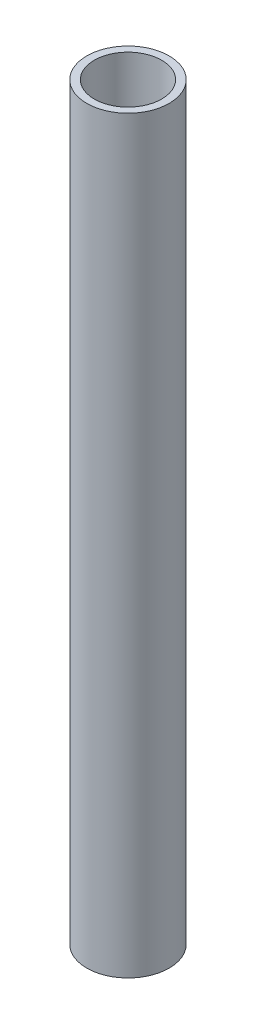
ISO-10303-21;
HEADER;
FILE_DESCRIPTION(('STEP AP214'),'2;1');
FILE_NAME('part.step','',(''),(''),'','','');
FILE_SCHEMA(('AUTOMOTIVE_DESIGN { 1 0 10303 214 1 1 1 1 }'));
ENDSEC;
DATA;
#1=APPLICATION_CONTEXT('core data for automotive mechanical design processes');
#2=APPLICATION_PROTOCOL_DEFINITION('international standard','automotive_design',2000,#1);
#3=PRODUCT_CONTEXT('',#1,'mechanical');
#4=PRODUCT('Part','Part','',(#3));
#5=PRODUCT_RELATED_PRODUCT_CATEGORY('part','',(#4));
#6=PRODUCT_DEFINITION_FORMATION('','',#4);
#7=PRODUCT_DEFINITION_CONTEXT('part definition',#1,'design');
#8=PRODUCT_DEFINITION('design','',#6,#7);
#9=PRODUCT_DEFINITION_SHAPE('','',#8);
#10=(LENGTH_UNIT() NAMED_UNIT(*) SI_UNIT(.MILLI.,.METRE.));
#11=(NAMED_UNIT(*) PLANE_ANGLE_UNIT() SI_UNIT($,.RADIAN.));
#12=(NAMED_UNIT(*) SI_UNIT($,.STERADIAN.) SOLID_ANGLE_UNIT());
#13=UNCERTAINTY_MEASURE_WITH_UNIT(LENGTH_MEASURE(1.E-05),#10,'distance_accuracy_value','');
#14=(GEOMETRIC_REPRESENTATION_CONTEXT(3) GLOBAL_UNCERTAINTY_ASSIGNED_CONTEXT((#13)) GLOBAL_UNIT_ASSIGNED_CONTEXT((#10,
#11,#12)) REPRESENTATION_CONTEXT('',''));
#15=CARTESIAN_POINT('',(0.,0.,0.));
#16=DIRECTION('',(0.,0.,1.));
#17=DIRECTION('',(1.,0.,0.));
#18=AXIS2_PLACEMENT_3D('',#15,#16,#17);
#19=CARTESIAN_POINT('',(0.,100.,0.));
#20=DIRECTION('',(0.,1.,0.));
#21=DIRECTION('',(0.,0.,1.));
#22=AXIS2_PLACEMENT_3D('',#19,#20,#21);
#23=PLANE('',#22);
#24=CARTESIAN_POINT('',(0.,100.,0.));
#25=DIRECTION('',(0.,1.,0.));
#26=DIRECTION('',(0.,0.,1.));
#27=AXIS2_PLACEMENT_3D('',#24,#25,#26);
#28=CIRCLE('',#27,5.5);
#29=CARTESIAN_POINT('',(0.,100.,5.5));
#30=VERTEX_POINT('',#29);
#31=EDGE_CURVE('E10',#30,#30,#28,.T.);
#32=ORIENTED_EDGE('',*,*,#31,.T.);
#33=EDGE_LOOP('',(#32));
#34=FACE_BOUND('',#33,.T.);
#35=CARTESIAN_POINT('',(0.,100.,0.));
#36=DIRECTION('',(0.,1.,0.));
#37=DIRECTION('',(0.,0.,1.));
#38=AXIS2_PLACEMENT_3D('',#35,#36,#37);
#39=CIRCLE('',#38,4.5);
#40=CARTESIAN_POINT('',(0.,100.,4.5));
#41=VERTEX_POINT('',#40);
#42=EDGE_CURVE('E42',#41,#41,#39,.T.);
#43=ORIENTED_EDGE('',*,*,#42,.F.);
#44=EDGE_LOOP('',(#43));
#45=FACE_BOUND('',#44,.T.);
#46=ADVANCED_FACE('F31',(#34,#45),#23,.T.);
#47=CARTESIAN_POINT('',(0.,0.,0.));
#48=DIRECTION('',(0.,1.,0.));
#49=DIRECTION('',(0.,0.,1.));
#50=AXIS2_PLACEMENT_3D('',#47,#48,#49);
#51=PLANE('',#50);
#52=CARTESIAN_POINT('',(0.,0.,0.));
#53=DIRECTION('',(0.,1.,0.));
#54=DIRECTION('',(0.,0.,1.));
#55=AXIS2_PLACEMENT_3D('',#52,#53,#54);
#56=CIRCLE('',#55,5.5);
#57=CARTESIAN_POINT('',(0.,0.,5.5));
#58=VERTEX_POINT('',#57);
#59=EDGE_CURVE('E35',#58,#58,#56,.T.);
#60=ORIENTED_EDGE('',*,*,#59,.F.);
#61=EDGE_LOOP('',(#60));
#62=FACE_BOUND('',#61,.T.);
#63=CARTESIAN_POINT('',(0.,0.,0.));
#64=DIRECTION('',(0.,1.,0.));
#65=DIRECTION('',(0.,0.,1.));
#66=AXIS2_PLACEMENT_3D('',#63,#64,#65);
#67=CIRCLE('',#66,4.5);
#68=CARTESIAN_POINT('',(0.,0.,4.5));
#69=VERTEX_POINT('',#68);
#70=EDGE_CURVE('E44',#69,#69,#67,.T.);
#71=ORIENTED_EDGE('',*,*,#70,.T.);
#72=EDGE_LOOP('',(#71));
#73=FACE_BOUND('',#72,.T.);
#74=ADVANCED_FACE('F54',(#62,#73),#51,.F.);
#75=CARTESIAN_POINT('',(0.,100.,0.));
#76=DIRECTION('',(0.,-1.,0.));
#77=DIRECTION('',(0.,0.,-1.));
#78=AXIS2_PLACEMENT_3D('',#75,#76,#77);
#79=CYLINDRICAL_SURFACE('',#78,5.5);
#80=ORIENTED_EDGE('',*,*,#31,.F.);
#81=EDGE_LOOP('',(#80));
#82=FACE_BOUND('',#81,.T.);
#83=ORIENTED_EDGE('',*,*,#59,.T.);
#84=EDGE_LOOP('',(#83));
#85=FACE_BOUND('',#84,.T.);
#86=ADVANCED_FACE('F33',(#82,#85),#79,.T.);
#87=CARTESIAN_POINT('',(0.,100.,0.));
#88=DIRECTION('',(0.,-1.,0.));
#89=DIRECTION('',(0.,0.,-1.));
#90=AXIS2_PLACEMENT_3D('',#87,#88,#89);
#91=CYLINDRICAL_SURFACE('',#90,4.5);
#92=ORIENTED_EDGE('',*,*,#42,.T.);
#93=EDGE_LOOP('',(#92));
#94=FACE_BOUND('',#93,.T.);
#95=ORIENTED_EDGE('',*,*,#70,.F.);
#96=EDGE_LOOP('',(#95));
#97=FACE_BOUND('',#96,.T.);
#98=ADVANCED_FACE('F50',(#94,#97),#91,.F.);
#99=CLOSED_SHELL('',(#46,#74,#86,#98));
#100=MANIFOLD_SOLID_BREP('B2',#99);
#101=ADVANCED_BREP_SHAPE_REPRESENTATION('',(#18,#100),#14);
#102=SHAPE_DEFINITION_REPRESENTATION(#9,#101);
ENDSEC;
END-ISO-10303-21;
